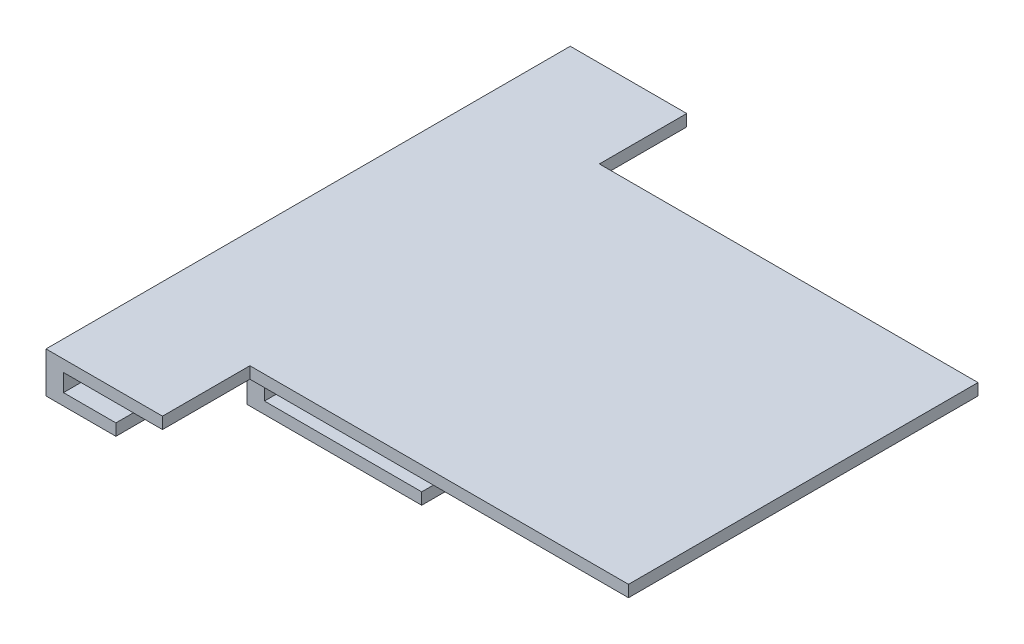
ISO-10303-21;
HEADER;
FILE_DESCRIPTION(('STEP AP214'),'2;1');
FILE_NAME('part.step','',(''),(''),'','','');
FILE_SCHEMA(('AUTOMOTIVE_DESIGN { 1 0 10303 214 1 1 1 1 }'));
ENDSEC;
DATA;
#1=APPLICATION_CONTEXT('core data for automotive mechanical design processes');
#2=APPLICATION_PROTOCOL_DEFINITION('international standard','automotive_design',2000,#1);
#3=PRODUCT_CONTEXT('',#1,'mechanical');
#4=PRODUCT('Part','Part','',(#3));
#5=PRODUCT_RELATED_PRODUCT_CATEGORY('part','',(#4));
#6=PRODUCT_DEFINITION_FORMATION('','',#4);
#7=PRODUCT_DEFINITION_CONTEXT('part definition',#1,'design');
#8=PRODUCT_DEFINITION('design','',#6,#7);
#9=PRODUCT_DEFINITION_SHAPE('','',#8);
#10=(LENGTH_UNIT() NAMED_UNIT(*) SI_UNIT(.MILLI.,.METRE.));
#11=(NAMED_UNIT(*) PLANE_ANGLE_UNIT() SI_UNIT($,.RADIAN.));
#12=(NAMED_UNIT(*) SI_UNIT($,.STERADIAN.) SOLID_ANGLE_UNIT());
#13=UNCERTAINTY_MEASURE_WITH_UNIT(LENGTH_MEASURE(1.E-05),#10,'distance_accuracy_value','');
#14=(GEOMETRIC_REPRESENTATION_CONTEXT(3) GLOBAL_UNCERTAINTY_ASSIGNED_CONTEXT((#13)) GLOBAL_UNIT_ASSIGNED_CONTEXT((#10,
#11,#12)) REPRESENTATION_CONTEXT('',''));
#15=CARTESIAN_POINT('',(0.,0.,0.));
#16=DIRECTION('',(0.,0.,1.));
#17=DIRECTION('',(1.,0.,0.));
#18=AXIS2_PLACEMENT_3D('',#15,#16,#17);
#19=CARTESIAN_POINT('',(0.,0.,0.));
#20=DIRECTION('',(0.,1.,0.));
#21=DIRECTION('',(0.,0.,1.));
#22=AXIS2_PLACEMENT_3D('',#19,#20,#21);
#23=PLANE('',#22);
#24=DIRECTION('',(0.,0.,1.));
#25=VECTOR('',#24,1.);
#26=CARTESIAN_POINT('',(-21.,0.,29.));
#27=LINE('',#26,#25);
#28=CARTESIAN_POINT('',(-21.,0.,-29.));
#29=VERTEX_POINT('',#28);
#30=CARTESIAN_POINT('',(-21.,0.,29.));
#31=VERTEX_POINT('',#30);
#32=EDGE_CURVE('E337',#29,#31,#27,.T.);
#33=ORIENTED_EDGE('',*,*,#32,.F.);
#34=DIRECTION('',(1.,0.,0.));
#35=VECTOR('',#34,1.);
#36=CARTESIAN_POINT('',(-24.,0.,-29.));
#37=LINE('',#36,#35);
#38=CARTESIAN_POINT('',(-24.,0.,-29.));
#39=VERTEX_POINT('',#38);
#40=EDGE_CURVE('E341',#39,#29,#37,.T.);
#41=ORIENTED_EDGE('',*,*,#40,.F.);
#42=DIRECTION('',(0.,0.,-1.));
#43=VECTOR('',#42,1.);
#44=CARTESIAN_POINT('',(-24.,0.,29.));
#45=LINE('',#44,#43);
#46=CARTESIAN_POINT('',(-24.,0.,29.));
#47=VERTEX_POINT('',#46);
#48=EDGE_CURVE('E213',#47,#39,#45,.T.);
#49=ORIENTED_EDGE('',*,*,#48,.F.);
#50=DIRECTION('',(-1.,0.,0.));
#51=VECTOR('',#50,1.);
#52=CARTESIAN_POINT('',(-24.,0.,29.));
#53=LINE('',#52,#51);
#54=EDGE_CURVE('E344',#31,#47,#53,.T.);
#55=ORIENTED_EDGE('',*,*,#54,.F.);
#56=EDGE_LOOP('',(#33,#41,#49,#55));
#57=FACE_BOUND('',#56,.T.);
#58=DIRECTION('',(0.,0.,1.));
#59=VECTOR('',#58,1.);
#60=CARTESIAN_POINT('',(-39.5,0.,-45.));
#61=LINE('',#60,#59);
#62=CARTESIAN_POINT('',(-39.5,0.,-45.));
#63=VERTEX_POINT('',#62);
#64=CARTESIAN_POINT('',(-39.5,0.,-32.5));
#65=VERTEX_POINT('',#64);
#66=EDGE_CURVE('E284',#63,#65,#61,.T.);
#67=ORIENTED_EDGE('',*,*,#66,.F.);
#68=DIRECTION('',(-1.,0.,0.));
#69=VECTOR('',#68,1.);
#70=CARTESIAN_POINT('',(-42.5,0.,-45.));
#71=LINE('',#70,#69);
#72=CARTESIAN_POINT('',(-22.5,0.,-45.));
#73=VERTEX_POINT('',#72);
#74=EDGE_CURVE('E381',#73,#63,#71,.T.);
#75=ORIENTED_EDGE('',*,*,#74,.F.);
#76=DIRECTION('',(0.,0.,-1.));
#77=VECTOR('',#76,1.);
#78=CARTESIAN_POINT('',(-22.5,0.,-30.));
#79=LINE('',#78,#77);
#80=CARTESIAN_POINT('',(-22.5,0.,-30.));
#81=VERTEX_POINT('',#80);
#82=EDGE_CURVE('E379',#81,#73,#79,.T.);
#83=ORIENTED_EDGE('',*,*,#82,.F.);
#84=DIRECTION('',(-1.,0.,0.));
#85=VECTOR('',#84,1.);
#86=CARTESIAN_POINT('',(-22.5,0.,-30.));
#87=LINE('',#86,#85);
#88=CARTESIAN_POINT('',(42.5,0.,-30.));
#89=VERTEX_POINT('',#88);
#90=EDGE_CURVE('E377',#89,#81,#87,.T.);
#91=ORIENTED_EDGE('',*,*,#90,.F.);
#92=DIRECTION('',(0.,0.,-1.));
#93=VECTOR('',#92,1.);
#94=CARTESIAN_POINT('',(42.5,0.,-30.));
#95=LINE('',#94,#93);
#96=CARTESIAN_POINT('',(42.5,0.,30.));
#97=VERTEX_POINT('',#96);
#98=EDGE_CURVE('E355',#97,#89,#95,.T.);
#99=ORIENTED_EDGE('',*,*,#98,.F.);
#100=DIRECTION('',(1.,0.,0.));
#101=VECTOR('',#100,1.);
#102=CARTESIAN_POINT('',(-22.5,0.,30.));
#103=LINE('',#102,#101);
#104=CARTESIAN_POINT('',(-22.5,0.,30.));
#105=VERTEX_POINT('',#104);
#106=EDGE_CURVE('E360',#105,#97,#103,.T.);
#107=ORIENTED_EDGE('',*,*,#106,.F.);
#108=DIRECTION('',(0.,0.,-1.));
#109=VECTOR('',#108,1.);
#110=CARTESIAN_POINT('',(-22.5,0.,30.));
#111=LINE('',#110,#109);
#112=CARTESIAN_POINT('',(-22.5,0.,45.));
#113=VERTEX_POINT('',#112);
#114=EDGE_CURVE('E388',#113,#105,#111,.T.);
#115=ORIENTED_EDGE('',*,*,#114,.F.);
#116=DIRECTION('',(1.,0.,0.));
#117=VECTOR('',#116,1.);
#118=CARTESIAN_POINT('',(-42.5,0.,45.));
#119=LINE('',#118,#117);
#120=CARTESIAN_POINT('',(-39.5,0.,45.));
#121=VERTEX_POINT('',#120);
#122=EDGE_CURVE('E386',#121,#113,#119,.T.);
#123=ORIENTED_EDGE('',*,*,#122,.F.);
#124=DIRECTION('',(0.,0.,1.));
#125=VECTOR('',#124,1.);
#126=CARTESIAN_POINT('',(-39.5,0.,45.));
#127=LINE('',#126,#125);
#128=CARTESIAN_POINT('',(-39.5,0.,32.5));
#129=VERTEX_POINT('',#128);
#130=EDGE_CURVE('E315',#129,#121,#127,.T.);
#131=ORIENTED_EDGE('',*,*,#130,.F.);
#132=DIRECTION('',(-1.,0.,0.));
#133=VECTOR('',#132,1.);
#134=CARTESIAN_POINT('',(-39.5,0.,32.5));
#135=LINE('',#134,#133);
#136=CARTESIAN_POINT('',(-30.5,0.,32.5));
#137=VERTEX_POINT('',#136);
#138=EDGE_CURVE('E321',#137,#129,#135,.T.);
#139=ORIENTED_EDGE('',*,*,#138,.F.);
#140=DIRECTION('',(0.,0.,1.));
#141=VECTOR('',#140,1.);
#142=CARTESIAN_POINT('',(-30.5,0.,29.5));
#143=LINE('',#142,#141);
#144=CARTESIAN_POINT('',(-30.5,0.,29.5));
#145=VERTEX_POINT('',#144);
#146=EDGE_CURVE('E319',#145,#137,#143,.T.);
#147=ORIENTED_EDGE('',*,*,#146,.F.);
#148=DIRECTION('',(1.,0.,0.));
#149=VECTOR('',#148,1.);
#150=CARTESIAN_POINT('',(-40.5243011084905,0.,29.5));
#151=LINE('',#150,#149);
#152=CARTESIAN_POINT('',(-42.5,0.,29.5));
#153=VERTEX_POINT('',#152);
#154=EDGE_CURVE('E310',#153,#145,#151,.T.);
#155=ORIENTED_EDGE('',*,*,#154,.F.);
#156=DIRECTION('',(0.,0.,1.));
#157=VECTOR('',#156,1.);
#158=CARTESIAN_POINT('',(-42.5,0.,30.));
#159=LINE('',#158,#157);
#160=CARTESIAN_POINT('',(-42.5,0.,-29.5));
#161=VERTEX_POINT('',#160);
#162=EDGE_CURVE('E384',#161,#153,#159,.T.);
#163=ORIENTED_EDGE('',*,*,#162,.F.);
#164=DIRECTION('',(-1.,0.,0.));
#165=VECTOR('',#164,1.);
#166=CARTESIAN_POINT('',(-42.5,0.,-29.5));
#167=LINE('',#166,#165);
#168=CARTESIAN_POINT('',(-30.5,0.,-29.5));
#169=VERTEX_POINT('',#168);
#170=EDGE_CURVE('E289',#169,#161,#167,.T.);
#171=ORIENTED_EDGE('',*,*,#170,.F.);
#172=DIRECTION('',(0.,0.,1.));
#173=VECTOR('',#172,1.);
#174=CARTESIAN_POINT('',(-30.5,0.,-29.5));
#175=LINE('',#174,#173);
#176=CARTESIAN_POINT('',(-30.5,0.,-32.5));
#177=VERTEX_POINT('',#176);
#178=EDGE_CURVE('E295',#177,#169,#175,.T.);
#179=ORIENTED_EDGE('',*,*,#178,.F.);
#180=DIRECTION('',(1.,0.,0.));
#181=VECTOR('',#180,1.);
#182=CARTESIAN_POINT('',(-39.5,0.,-32.5));
#183=LINE('',#182,#181);
#184=EDGE_CURVE('E293',#65,#177,#183,.T.);
#185=ORIENTED_EDGE('',*,*,#184,.F.);
#186=EDGE_LOOP('',(#67,#75,#83,#91,#99,#107,#115,#123,#131,#139,#147,#155,#163,#171,#179,#185));
#187=FACE_BOUND('',#186,.T.);
#188=ADVANCED_FACE('F33',(#57,#187),#23,.F.);
#189=CARTESIAN_POINT('',(42.5,2.,-30.));
#190=DIRECTION('',(-1.,0.,0.));
#191=DIRECTION('',(0.,0.,1.));
#192=AXIS2_PLACEMENT_3D('',#189,#190,#191);
#193=PLANE('',#192);
#194=ORIENTED_EDGE('',*,*,#98,.T.);
#195=DIRECTION('',(0.,-1.,0.));
#196=VECTOR('',#195,1.);
#197=CARTESIAN_POINT('',(42.5,2.,-30.));
#198=LINE('',#197,#196);
#199=CARTESIAN_POINT('',(42.5,2.,-30.));
#200=VERTEX_POINT('',#199);
#201=EDGE_CURVE('E11',#200,#89,#198,.T.);
#202=ORIENTED_EDGE('',*,*,#201,.F.);
#203=DIRECTION('',(0.,0.,-1.));
#204=VECTOR('',#203,1.);
#205=CARTESIAN_POINT('',(42.5,2.,-30.));
#206=LINE('',#205,#204);
#207=CARTESIAN_POINT('',(42.5,2.,30.));
#208=VERTEX_POINT('',#207);
#209=EDGE_CURVE('E356',#208,#200,#206,.T.);
#210=ORIENTED_EDGE('',*,*,#209,.F.);
#211=DIRECTION('',(0.,-1.,0.));
#212=VECTOR('',#211,1.);
#213=CARTESIAN_POINT('',(42.5,2.,30.));
#214=LINE('',#213,#212);
#215=EDGE_CURVE('E374',#208,#97,#214,.T.);
#216=ORIENTED_EDGE('',*,*,#215,.T.);
#217=EDGE_LOOP('',(#194,#202,#210,#216));
#218=FACE_BOUND('',#217,.T.);
#219=ADVANCED_FACE('F35',(#218),#193,.F.);
#220=CARTESIAN_POINT('',(-22.5,2.,-30.));
#221=DIRECTION('',(0.,0.,1.));
#222=DIRECTION('',(1.,0.,0.));
#223=AXIS2_PLACEMENT_3D('',#220,#221,#222);
#224=PLANE('',#223);
#225=ORIENTED_EDGE('',*,*,#90,.T.);
#226=DIRECTION('',(0.,-1.,0.));
#227=VECTOR('',#226,1.);
#228=CARTESIAN_POINT('',(-22.5,2.,-30.));
#229=LINE('',#228,#227);
#230=CARTESIAN_POINT('',(-22.5,2.,-30.));
#231=VERTEX_POINT('',#230);
#232=EDGE_CURVE('E41',#231,#81,#229,.T.);
#233=ORIENTED_EDGE('',*,*,#232,.F.);
#234=DIRECTION('',(-1.,0.,0.));
#235=VECTOR('',#234,1.);
#236=CARTESIAN_POINT('',(-22.5,2.,-30.));
#237=LINE('',#236,#235);
#238=EDGE_CURVE('E359',#200,#231,#237,.T.);
#239=ORIENTED_EDGE('',*,*,#238,.F.);
#240=ORIENTED_EDGE('',*,*,#201,.T.);
#241=EDGE_LOOP('',(#225,#233,#239,#240));
#242=FACE_BOUND('',#241,.T.);
#243=ADVANCED_FACE('F431',(#242),#224,.F.);
#244=CARTESIAN_POINT('',(-22.5,2.,-30.));
#245=DIRECTION('',(-1.,0.,0.));
#246=DIRECTION('',(0.,0.,1.));
#247=AXIS2_PLACEMENT_3D('',#244,#245,#246);
#248=PLANE('',#247);
#249=ORIENTED_EDGE('',*,*,#82,.T.);
#250=DIRECTION('',(0.,-1.,0.));
#251=VECTOR('',#250,1.);
#252=CARTESIAN_POINT('',(-22.5,2.,-45.));
#253=LINE('',#252,#251);
#254=CARTESIAN_POINT('',(-22.5,2.,-45.));
#255=VERTEX_POINT('',#254);
#256=EDGE_CURVE('E403',#255,#73,#253,.T.);
#257=ORIENTED_EDGE('',*,*,#256,.F.);
#258=DIRECTION('',(0.,0.,-1.));
#259=VECTOR('',#258,1.);
#260=CARTESIAN_POINT('',(-22.5,2.,-30.));
#261=LINE('',#260,#259);
#262=EDGE_CURVE('E362',#231,#255,#261,.T.);
#263=ORIENTED_EDGE('',*,*,#262,.F.);
#264=ORIENTED_EDGE('',*,*,#232,.T.);
#265=EDGE_LOOP('',(#249,#257,#263,#264));
#266=FACE_BOUND('',#265,.T.);
#267=ADVANCED_FACE('F410',(#266),#248,.F.);
#268=CARTESIAN_POINT('',(-42.5,2.,-45.));
#269=DIRECTION('',(0.,0.,1.));
#270=DIRECTION('',(1.,0.,0.));
#271=AXIS2_PLACEMENT_3D('',#268,#269,#270);
#272=PLANE('',#271);
#273=ORIENTED_EDGE('',*,*,#74,.T.);
#274=DIRECTION('',(0.,1.,0.));
#275=VECTOR('',#274,1.);
#276=CARTESIAN_POINT('',(-39.5,-3.,-45.));
#277=LINE('',#276,#275);
#278=CARTESIAN_POINT('',(-39.5,-3.,-45.));
#279=VERTEX_POINT('',#278);
#280=EDGE_CURVE('E308',#279,#63,#277,.T.);
#281=ORIENTED_EDGE('',*,*,#280,.F.);
#282=DIRECTION('',(1.,0.,0.));
#283=VECTOR('',#282,1.);
#284=CARTESIAN_POINT('',(-30.5,-3.,-45.));
#285=LINE('',#284,#283);
#286=CARTESIAN_POINT('',(-30.5,-3.,-45.));
#287=VERTEX_POINT('',#286);
#288=EDGE_CURVE('E252',#279,#287,#285,.T.);
#289=ORIENTED_EDGE('',*,*,#288,.T.);
#290=DIRECTION('',(0.,1.,0.));
#291=VECTOR('',#290,1.);
#292=CARTESIAN_POINT('',(-30.5,-5.,-45.));
#293=LINE('',#292,#291);
#294=CARTESIAN_POINT('',(-30.5,-5.,-45.));
#295=VERTEX_POINT('',#294);
#296=EDGE_CURVE('E260',#295,#287,#293,.T.);
#297=ORIENTED_EDGE('',*,*,#296,.F.);
#298=DIRECTION('',(1.,0.,0.));
#299=VECTOR('',#298,1.);
#300=CARTESIAN_POINT('',(-30.5,-5.,-45.));
#301=LINE('',#300,#299);
#302=CARTESIAN_POINT('',(-42.5,-5.,-45.));
#303=VERTEX_POINT('',#302);
#304=EDGE_CURVE('E258',#303,#295,#301,.T.);
#305=ORIENTED_EDGE('',*,*,#304,.F.);
#306=DIRECTION('',(0.,-1.,0.));
#307=VECTOR('',#306,1.);
#308=CARTESIAN_POINT('',(-42.5,2.,-45.));
#309=LINE('',#308,#307);
#310=CARTESIAN_POINT('',(-42.5,2.,-45.));
#311=VERTEX_POINT('',#310);
#312=EDGE_CURVE('E401',#311,#303,#309,.T.);
#313=ORIENTED_EDGE('',*,*,#312,.F.);
#314=DIRECTION('',(-1.,0.,0.));
#315=VECTOR('',#314,1.);
#316=CARTESIAN_POINT('',(-42.5,2.,-45.));
#317=LINE('',#316,#315);
#318=EDGE_CURVE('E364',#255,#311,#317,.T.);
#319=ORIENTED_EDGE('',*,*,#318,.F.);
#320=ORIENTED_EDGE('',*,*,#256,.T.);
#321=EDGE_LOOP('',(#273,#281,#289,#297,#305,#313,#319,#320));
#322=FACE_BOUND('',#321,.T.);
#323=ADVANCED_FACE('F420',(#322),#272,.F.);
#324=CARTESIAN_POINT('',(-42.5,2.,30.));
#325=DIRECTION('',(1.,0.,0.));
#326=DIRECTION('',(0.,0.,-1.));
#327=AXIS2_PLACEMENT_3D('',#324,#325,#326);
#328=PLANE('',#327);
#329=ORIENTED_EDGE('',*,*,#312,.T.);
#330=DIRECTION('',(0.,0.,-1.));
#331=VECTOR('',#330,1.);
#332=CARTESIAN_POINT('',(-42.5,-5.,-29.5));
#333=LINE('',#332,#331);
#334=CARTESIAN_POINT('',(-42.5,-5.,-29.5));
#335=VERTEX_POINT('',#334);
#336=EDGE_CURVE('E255',#335,#303,#333,.T.);
#337=ORIENTED_EDGE('',*,*,#336,.F.);
#338=DIRECTION('',(0.,1.,0.));
#339=VECTOR('',#338,1.);
#340=CARTESIAN_POINT('',(-42.5,-3.,-29.5));
#341=LINE('',#340,#339);
#342=EDGE_CURVE('E48',#335,#161,#341,.T.);
#343=ORIENTED_EDGE('',*,*,#342,.T.);
#344=ORIENTED_EDGE('',*,*,#162,.T.);
#345=DIRECTION('',(0.,1.,0.));
#346=VECTOR('',#345,1.);
#347=CARTESIAN_POINT('',(-42.5,-3.,29.5));
#348=LINE('',#347,#346);
#349=CARTESIAN_POINT('',(-42.5,-5.,29.5));
#350=VERTEX_POINT('',#349);
#351=EDGE_CURVE('E334',#350,#153,#348,.T.);
#352=ORIENTED_EDGE('',*,*,#351,.F.);
#353=DIRECTION('',(0.,0.,-1.));
#354=VECTOR('',#353,1.);
#355=CARTESIAN_POINT('',(-42.5,-5.,45.));
#356=LINE('',#355,#354);
#357=CARTESIAN_POINT('',(-42.5,-5.,45.));
#358=VERTEX_POINT('',#357);
#359=EDGE_CURVE('E267',#358,#350,#356,.T.);
#360=ORIENTED_EDGE('',*,*,#359,.F.);
#361=DIRECTION('',(0.,-1.,0.));
#362=VECTOR('',#361,1.);
#363=CARTESIAN_POINT('',(-42.5,2.,45.));
#364=LINE('',#363,#362);
#365=CARTESIAN_POINT('',(-42.5,2.,45.));
#366=VERTEX_POINT('',#365);
#367=EDGE_CURVE('E399',#366,#358,#364,.T.);
#368=ORIENTED_EDGE('',*,*,#367,.F.);
#369=DIRECTION('',(0.,0.,1.));
#370=VECTOR('',#369,1.);
#371=CARTESIAN_POINT('',(-42.5,2.,-30.));
#372=LINE('',#371,#370);
#373=EDGE_CURVE('E366',#311,#366,#372,.T.);
#374=ORIENTED_EDGE('',*,*,#373,.F.);
#375=EDGE_LOOP('',(#329,#337,#343,#344,#352,#360,#368,#374));
#376=FACE_BOUND('',#375,.T.);
#377=ADVANCED_FACE('F468',(#376),#328,.F.);
#378=CARTESIAN_POINT('',(-42.5,2.,45.));
#379=DIRECTION('',(0.,0.,-1.));
#380=DIRECTION('',(-1.,0.,0.));
#381=AXIS2_PLACEMENT_3D('',#378,#379,#380);
#382=PLANE('',#381);
#383=ORIENTED_EDGE('',*,*,#367,.T.);
#384=DIRECTION('',(-1.,0.,0.));
#385=VECTOR('',#384,1.);
#386=CARTESIAN_POINT('',(-42.5,-5.,45.));
#387=LINE('',#386,#385);
#388=CARTESIAN_POINT('',(-30.5,-5.,45.));
#389=VERTEX_POINT('',#388);
#390=EDGE_CURVE('E276',#389,#358,#387,.T.);
#391=ORIENTED_EDGE('',*,*,#390,.F.);
#392=DIRECTION('',(0.,1.,0.));
#393=VECTOR('',#392,1.);
#394=CARTESIAN_POINT('',(-30.5,-5.,45.));
#395=LINE('',#394,#393);
#396=CARTESIAN_POINT('',(-30.5,-3.,45.));
#397=VERTEX_POINT('',#396);
#398=EDGE_CURVE('E279',#389,#397,#395,.T.);
#399=ORIENTED_EDGE('',*,*,#398,.T.);
#400=DIRECTION('',(-1.,0.,0.));
#401=VECTOR('',#400,1.);
#402=CARTESIAN_POINT('',(-42.5,-3.,45.));
#403=LINE('',#402,#401);
#404=CARTESIAN_POINT('',(-39.5,-3.,45.));
#405=VERTEX_POINT('',#404);
#406=EDGE_CURVE('E271',#397,#405,#403,.T.);
#407=ORIENTED_EDGE('',*,*,#406,.T.);
#408=DIRECTION('',(0.,1.,0.));
#409=VECTOR('',#408,1.);
#410=CARTESIAN_POINT('',(-39.5,-3.,45.));
#411=LINE('',#410,#409);
#412=EDGE_CURVE('E56',#405,#121,#411,.T.);
#413=ORIENTED_EDGE('',*,*,#412,.T.);
#414=ORIENTED_EDGE('',*,*,#122,.T.);
#415=DIRECTION('',(0.,-1.,0.));
#416=VECTOR('',#415,1.);
#417=CARTESIAN_POINT('',(-22.5,2.,45.));
#418=LINE('',#417,#416);
#419=CARTESIAN_POINT('',(-22.5,2.,45.));
#420=VERTEX_POINT('',#419);
#421=EDGE_CURVE('E396',#420,#113,#418,.T.);
#422=ORIENTED_EDGE('',*,*,#421,.F.);
#423=DIRECTION('',(1.,0.,0.));
#424=VECTOR('',#423,1.);
#425=CARTESIAN_POINT('',(-42.5,2.,45.));
#426=LINE('',#425,#424);
#427=EDGE_CURVE('E368',#366,#420,#426,.T.);
#428=ORIENTED_EDGE('',*,*,#427,.F.);
#429=EDGE_LOOP('',(#383,#391,#399,#407,#413,#414,#422,#428));
#430=FACE_BOUND('',#429,.T.);
#431=ADVANCED_FACE('F446',(#430),#382,.F.);
#432=CARTESIAN_POINT('',(-22.5,2.,30.));
#433=DIRECTION('',(-1.,0.,0.));
#434=DIRECTION('',(0.,0.,1.));
#435=AXIS2_PLACEMENT_3D('',#432,#433,#434);
#436=PLANE('',#435);
#437=ORIENTED_EDGE('',*,*,#114,.T.);
#438=DIRECTION('',(0.,-1.,0.));
#439=VECTOR('',#438,1.);
#440=CARTESIAN_POINT('',(-22.5,2.,30.));
#441=LINE('',#440,#439);
#442=CARTESIAN_POINT('',(-22.5,2.,30.));
#443=VERTEX_POINT('',#442);
#444=EDGE_CURVE('E393',#443,#105,#441,.T.);
#445=ORIENTED_EDGE('',*,*,#444,.F.);
#446=DIRECTION('',(0.,0.,-1.));
#447=VECTOR('',#446,1.);
#448=CARTESIAN_POINT('',(-22.5,2.,30.));
#449=LINE('',#448,#447);
#450=EDGE_CURVE('E370',#420,#443,#449,.T.);
#451=ORIENTED_EDGE('',*,*,#450,.F.);
#452=ORIENTED_EDGE('',*,*,#421,.T.);
#453=EDGE_LOOP('',(#437,#445,#451,#452));
#454=FACE_BOUND('',#453,.T.);
#455=ADVANCED_FACE('F443',(#454),#436,.F.);
#456=CARTESIAN_POINT('',(-22.5,2.,30.));
#457=DIRECTION('',(0.,0.,-1.));
#458=DIRECTION('',(-1.,0.,0.));
#459=AXIS2_PLACEMENT_3D('',#456,#457,#458);
#460=PLANE('',#459);
#461=ORIENTED_EDGE('',*,*,#106,.T.);
#462=ORIENTED_EDGE('',*,*,#215,.F.);
#463=DIRECTION('',(1.,0.,0.));
#464=VECTOR('',#463,1.);
#465=CARTESIAN_POINT('',(-22.5,2.,30.));
#466=LINE('',#465,#464);
#467=EDGE_CURVE('E372',#443,#208,#466,.T.);
#468=ORIENTED_EDGE('',*,*,#467,.F.);
#469=ORIENTED_EDGE('',*,*,#444,.T.);
#470=EDGE_LOOP('',(#461,#462,#468,#469));
#471=FACE_BOUND('',#470,.T.);
#472=ADVANCED_FACE('F438',(#471),#460,.F.);
#473=CARTESIAN_POINT('',(0.,2.,0.));
#474=DIRECTION('',(0.,1.,0.));
#475=DIRECTION('',(0.,0.,1.));
#476=AXIS2_PLACEMENT_3D('',#473,#474,#475);
#477=PLANE('',#476);
#478=ORIENTED_EDGE('',*,*,#209,.T.);
#479=ORIENTED_EDGE('',*,*,#238,.T.);
#480=ORIENTED_EDGE('',*,*,#262,.T.);
#481=ORIENTED_EDGE('',*,*,#318,.T.);
#482=ORIENTED_EDGE('',*,*,#373,.T.);
#483=ORIENTED_EDGE('',*,*,#427,.T.);
#484=ORIENTED_EDGE('',*,*,#450,.T.);
#485=ORIENTED_EDGE('',*,*,#467,.T.);
#486=EDGE_LOOP('',(#478,#479,#480,#481,#482,#483,#484,#485));
#487=FACE_BOUND('',#486,.T.);
#488=ADVANCED_FACE('F427',(#487),#477,.T.);
#489=CARTESIAN_POINT('',(-21.,-3.,29.));
#490=DIRECTION('',(-1.,0.,0.));
#491=DIRECTION('',(0.,0.,1.));
#492=AXIS2_PLACEMENT_3D('',#489,#490,#491);
#493=PLANE('',#492);
#494=ORIENTED_EDGE('',*,*,#32,.T.);
#495=DIRECTION('',(0.,1.,0.));
#496=VECTOR('',#495,1.);
#497=CARTESIAN_POINT('',(-21.,-3.,29.));
#498=LINE('',#497,#496);
#499=CARTESIAN_POINT('',(-21.,-3.,29.));
#500=VERTEX_POINT('',#499);
#501=EDGE_CURVE('E352',#500,#31,#498,.T.);
#502=ORIENTED_EDGE('',*,*,#501,.F.);
#503=DIRECTION('',(0.,0.,1.));
#504=VECTOR('',#503,1.);
#505=CARTESIAN_POINT('',(-21.,-3.,29.));
#506=LINE('',#505,#504);
#507=CARTESIAN_POINT('',(-21.,-3.,-29.));
#508=VERTEX_POINT('',#507);
#509=EDGE_CURVE('E338',#508,#500,#506,.T.);
#510=ORIENTED_EDGE('',*,*,#509,.F.);
#511=DIRECTION('',(0.,1.,0.));
#512=VECTOR('',#511,1.);
#513=CARTESIAN_POINT('',(-21.,-3.,-29.));
#514=LINE('',#513,#512);
#515=EDGE_CURVE('E217',#508,#29,#514,.T.);
#516=ORIENTED_EDGE('',*,*,#515,.T.);
#517=EDGE_LOOP('',(#494,#502,#510,#516));
#518=FACE_BOUND('',#517,.T.);
#519=ADVANCED_FACE('F543',(#518),#493,.F.);
#520=CARTESIAN_POINT('',(-24.,-3.,29.));
#521=DIRECTION('',(0.,0.,-1.));
#522=DIRECTION('',(-1.,0.,0.));
#523=AXIS2_PLACEMENT_3D('',#520,#521,#522);
#524=PLANE('',#523);
#525=ORIENTED_EDGE('',*,*,#54,.T.);
#526=DIRECTION('',(0.,1.,0.));
#527=VECTOR('',#526,1.);
#528=CARTESIAN_POINT('',(-24.,-3.,29.));
#529=LINE('',#528,#527);
#530=CARTESIAN_POINT('',(-24.,-5.,29.));
#531=VERTEX_POINT('',#530);
#532=EDGE_CURVE('E216',#531,#47,#529,.T.);
#533=ORIENTED_EDGE('',*,*,#532,.F.);
#534=DIRECTION('',(-1.,0.,0.));
#535=VECTOR('',#534,1.);
#536=CARTESIAN_POINT('',(-24.,-5.,29.));
#537=LINE('',#536,#535);
#538=CARTESIAN_POINT('',(5.99999999999999,-5.,29.));
#539=VERTEX_POINT('',#538);
#540=EDGE_CURVE('E231',#539,#531,#537,.T.);
#541=ORIENTED_EDGE('',*,*,#540,.F.);
#542=DIRECTION('',(0.,1.,0.));
#543=VECTOR('',#542,1.);
#544=CARTESIAN_POINT('',(5.99999999999999,-5.,29.));
#545=LINE('',#544,#543);
#546=CARTESIAN_POINT('',(5.99999999999999,-3.,29.));
#547=VERTEX_POINT('',#546);
#548=EDGE_CURVE('E240',#539,#547,#545,.T.);
#549=ORIENTED_EDGE('',*,*,#548,.T.);
#550=DIRECTION('',(-1.,0.,0.));
#551=VECTOR('',#550,1.);
#552=CARTESIAN_POINT('',(-24.,-3.,29.));
#553=LINE('',#552,#551);
#554=EDGE_CURVE('E232',#547,#500,#553,.T.);
#555=ORIENTED_EDGE('',*,*,#554,.T.);
#556=ORIENTED_EDGE('',*,*,#501,.T.);
#557=EDGE_LOOP('',(#525,#533,#541,#549,#555,#556));
#558=FACE_BOUND('',#557,.T.);
#559=ADVANCED_FACE('F548',(#558),#524,.F.);
#560=CARTESIAN_POINT('',(-24.,-3.,29.));
#561=DIRECTION('',(1.,0.,0.));
#562=DIRECTION('',(0.,0.,-1.));
#563=AXIS2_PLACEMENT_3D('',#560,#561,#562);
#564=PLANE('',#563);
#565=ORIENTED_EDGE('',*,*,#48,.T.);
#566=DIRECTION('',(0.,1.,0.));
#567=VECTOR('',#566,1.);
#568=CARTESIAN_POINT('',(-24.,-3.,-29.));
#569=LINE('',#568,#567);
#570=CARTESIAN_POINT('',(-24.,-5.,-29.));
#571=VERTEX_POINT('',#570);
#572=EDGE_CURVE('E207',#571,#39,#569,.T.);
#573=ORIENTED_EDGE('',*,*,#572,.F.);
#574=DIRECTION('',(0.,0.,-1.));
#575=VECTOR('',#574,1.);
#576=CARTESIAN_POINT('',(-24.,-5.,29.));
#577=LINE('',#576,#575);
#578=EDGE_CURVE('E212',#531,#571,#577,.T.);
#579=ORIENTED_EDGE('',*,*,#578,.F.);
#580=ORIENTED_EDGE('',*,*,#532,.T.);
#581=EDGE_LOOP('',(#565,#573,#579,#580));
#582=FACE_BOUND('',#581,.T.);
#583=ADVANCED_FACE('F209',(#582),#564,.F.);
#584=CARTESIAN_POINT('',(-24.,-3.,-29.));
#585=DIRECTION('',(0.,0.,1.));
#586=DIRECTION('',(1.,0.,0.));
#587=AXIS2_PLACEMENT_3D('',#584,#585,#586);
#588=PLANE('',#587);
#589=ORIENTED_EDGE('',*,*,#40,.T.);
#590=ORIENTED_EDGE('',*,*,#515,.F.);
#591=DIRECTION('',(1.,0.,0.));
#592=VECTOR('',#591,1.);
#593=CARTESIAN_POINT('',(-24.,-3.,-29.));
#594=LINE('',#593,#592);
#595=CARTESIAN_POINT('',(5.99999999999999,-3.,-29.));
#596=VERTEX_POINT('',#595);
#597=EDGE_CURVE('E241',#508,#596,#594,.T.);
#598=ORIENTED_EDGE('',*,*,#597,.T.);
#599=DIRECTION('',(0.,1.,0.));
#600=VECTOR('',#599,1.);
#601=CARTESIAN_POINT('',(5.99999999999999,-5.,-29.));
#602=LINE('',#601,#600);
#603=CARTESIAN_POINT('',(5.99999999999999,-5.,-29.));
#604=VERTEX_POINT('',#603);
#605=EDGE_CURVE('E223',#604,#596,#602,.T.);
#606=ORIENTED_EDGE('',*,*,#605,.F.);
#607=DIRECTION('',(1.,0.,0.));
#608=VECTOR('',#607,1.);
#609=CARTESIAN_POINT('',(-24.,-5.,-29.));
#610=LINE('',#609,#608);
#611=EDGE_CURVE('E220',#571,#604,#610,.T.);
#612=ORIENTED_EDGE('',*,*,#611,.F.);
#613=ORIENTED_EDGE('',*,*,#572,.T.);
#614=EDGE_LOOP('',(#589,#590,#598,#606,#612,#613));
#615=FACE_BOUND('',#614,.T.);
#616=ADVANCED_FACE('F221',(#615),#588,.F.);
#617=CARTESIAN_POINT('',(-40.5243011084905,-3.,29.5));
#618=DIRECTION('',(0.,0.,1.));
#619=DIRECTION('',(1.,0.,0.));
#620=AXIS2_PLACEMENT_3D('',#617,#618,#619);
#621=PLANE('',#620);
#622=ORIENTED_EDGE('',*,*,#154,.T.);
#623=DIRECTION('',(0.,1.,0.));
#624=VECTOR('',#623,1.);
#625=CARTESIAN_POINT('',(-30.5,-3.,29.5));
#626=LINE('',#625,#624);
#627=CARTESIAN_POINT('',(-30.5,-5.,29.5));
#628=VERTEX_POINT('',#627);
#629=EDGE_CURVE('E331',#628,#145,#626,.T.);
#630=ORIENTED_EDGE('',*,*,#629,.F.);
#631=DIRECTION('',(1.,0.,0.));
#632=VECTOR('',#631,1.);
#633=CARTESIAN_POINT('',(-42.5,-5.,29.5));
#634=LINE('',#633,#632);
#635=EDGE_CURVE('E270',#350,#628,#634,.T.);
#636=ORIENTED_EDGE('',*,*,#635,.F.);
#637=ORIENTED_EDGE('',*,*,#351,.T.);
#638=EDGE_LOOP('',(#622,#630,#636,#637));
#639=FACE_BOUND('',#638,.T.);
#640=ADVANCED_FACE('F465',(#639),#621,.F.);
#641=CARTESIAN_POINT('',(-30.5,-3.,29.5));
#642=DIRECTION('',(-1.,0.,0.));
#643=DIRECTION('',(0.,0.,1.));
#644=AXIS2_PLACEMENT_3D('',#641,#642,#643);
#645=PLANE('',#644);
#646=ORIENTED_EDGE('',*,*,#146,.T.);
#647=DIRECTION('',(0.,1.,0.));
#648=VECTOR('',#647,1.);
#649=CARTESIAN_POINT('',(-30.5,-3.,32.5));
#650=LINE('',#649,#648);
#651=CARTESIAN_POINT('',(-30.5,-3.,32.5));
#652=VERTEX_POINT('',#651);
#653=EDGE_CURVE('E328',#652,#137,#650,.T.);
#654=ORIENTED_EDGE('',*,*,#653,.F.);
#655=DIRECTION('',(0.,0.,1.));
#656=VECTOR('',#655,1.);
#657=CARTESIAN_POINT('',(-30.5,-3.,45.));
#658=LINE('',#657,#656);
#659=EDGE_CURVE('E266',#652,#397,#658,.T.);
#660=ORIENTED_EDGE('',*,*,#659,.T.);
#661=ORIENTED_EDGE('',*,*,#398,.F.);
#662=DIRECTION('',(0.,0.,1.));
#663=VECTOR('',#662,1.);
#664=CARTESIAN_POINT('',(-30.5,-5.,45.));
#665=LINE('',#664,#663);
#666=EDGE_CURVE('E274',#628,#389,#665,.T.);
#667=ORIENTED_EDGE('',*,*,#666,.F.);
#668=ORIENTED_EDGE('',*,*,#629,.T.);
#669=EDGE_LOOP('',(#646,#654,#660,#661,#667,#668));
#670=FACE_BOUND('',#669,.T.);
#671=ADVANCED_FACE('F458',(#670),#645,.F.);
#672=CARTESIAN_POINT('',(-39.5,-3.,32.5));
#673=DIRECTION('',(0.,0.,-1.));
#674=DIRECTION('',(-1.,0.,0.));
#675=AXIS2_PLACEMENT_3D('',#672,#673,#674);
#676=PLANE('',#675);
#677=ORIENTED_EDGE('',*,*,#138,.T.);
#678=DIRECTION('',(0.,1.,0.));
#679=VECTOR('',#678,1.);
#680=CARTESIAN_POINT('',(-39.5,-3.,32.5));
#681=LINE('',#680,#679);
#682=CARTESIAN_POINT('',(-39.5,-3.,32.5));
#683=VERTEX_POINT('',#682);
#684=EDGE_CURVE('E325',#683,#129,#681,.T.);
#685=ORIENTED_EDGE('',*,*,#684,.F.);
#686=DIRECTION('',(-1.,0.,0.));
#687=VECTOR('',#686,1.);
#688=CARTESIAN_POINT('',(-39.5,-3.,32.5));
#689=LINE('',#688,#687);
#690=EDGE_CURVE('E311',#652,#683,#689,.T.);
#691=ORIENTED_EDGE('',*,*,#690,.F.);
#692=ORIENTED_EDGE('',*,*,#653,.T.);
#693=EDGE_LOOP('',(#677,#685,#691,#692));
#694=FACE_BOUND('',#693,.T.);
#695=ADVANCED_FACE('F455',(#694),#676,.F.);
#696=CARTESIAN_POINT('',(-39.5,-3.,45.));
#697=DIRECTION('',(-1.,0.,0.));
#698=DIRECTION('',(0.,0.,1.));
#699=AXIS2_PLACEMENT_3D('',#696,#697,#698);
#700=PLANE('',#699);
#701=ORIENTED_EDGE('',*,*,#130,.T.);
#702=ORIENTED_EDGE('',*,*,#412,.F.);
#703=DIRECTION('',(0.,0.,1.));
#704=VECTOR('',#703,1.);
#705=CARTESIAN_POINT('',(-39.5,-3.,45.));
#706=LINE('',#705,#704);
#707=EDGE_CURVE('E314',#683,#405,#706,.T.);
#708=ORIENTED_EDGE('',*,*,#707,.F.);
#709=ORIENTED_EDGE('',*,*,#684,.T.);
#710=EDGE_LOOP('',(#701,#702,#708,#709));
#711=FACE_BOUND('',#710,.T.);
#712=ADVANCED_FACE('F451',(#711),#700,.F.);
#713=CARTESIAN_POINT('',(-39.5,-3.,-45.));
#714=DIRECTION('',(-1.,0.,0.));
#715=DIRECTION('',(0.,0.,1.));
#716=AXIS2_PLACEMENT_3D('',#713,#714,#715);
#717=PLANE('',#716);
#718=ORIENTED_EDGE('',*,*,#66,.T.);
#719=DIRECTION('',(0.,1.,0.));
#720=VECTOR('',#719,1.);
#721=CARTESIAN_POINT('',(-39.5,-3.,-32.5));
#722=LINE('',#721,#720);
#723=CARTESIAN_POINT('',(-39.5,-3.,-32.5));
#724=VERTEX_POINT('',#723);
#725=EDGE_CURVE('E305',#724,#65,#722,.T.);
#726=ORIENTED_EDGE('',*,*,#725,.F.);
#727=DIRECTION('',(0.,0.,1.));
#728=VECTOR('',#727,1.);
#729=CARTESIAN_POINT('',(-39.5,-3.,-45.));
#730=LINE('',#729,#728);
#731=EDGE_CURVE('E285',#279,#724,#730,.T.);
#732=ORIENTED_EDGE('',*,*,#731,.F.);
#733=ORIENTED_EDGE('',*,*,#280,.T.);
#734=EDGE_LOOP('',(#718,#726,#732,#733));
#735=FACE_BOUND('',#734,.T.);
#736=ADVANCED_FACE('F592',(#735),#717,.F.);
#737=CARTESIAN_POINT('',(-39.5,-3.,-32.5));
#738=DIRECTION('',(0.,0.,1.));
#739=DIRECTION('',(1.,0.,0.));
#740=AXIS2_PLACEMENT_3D('',#737,#738,#739);
#741=PLANE('',#740);
#742=ORIENTED_EDGE('',*,*,#184,.T.);
#743=DIRECTION('',(0.,1.,0.));
#744=VECTOR('',#743,1.);
#745=CARTESIAN_POINT('',(-30.5,-3.,-32.5));
#746=LINE('',#745,#744);
#747=CARTESIAN_POINT('',(-30.5,-3.,-32.5));
#748=VERTEX_POINT('',#747);
#749=EDGE_CURVE('E302',#748,#177,#746,.T.);
#750=ORIENTED_EDGE('',*,*,#749,.F.);
#751=DIRECTION('',(1.,0.,0.));
#752=VECTOR('',#751,1.);
#753=CARTESIAN_POINT('',(-39.5,-3.,-32.5));
#754=LINE('',#753,#752);
#755=EDGE_CURVE('E288',#724,#748,#754,.T.);
#756=ORIENTED_EDGE('',*,*,#755,.F.);
#757=ORIENTED_EDGE('',*,*,#725,.T.);
#758=EDGE_LOOP('',(#742,#750,#756,#757));
#759=FACE_BOUND('',#758,.T.);
#760=ADVANCED_FACE('F599',(#759),#741,.F.);
#761=CARTESIAN_POINT('',(-30.5,-3.,-29.5));
#762=DIRECTION('',(-1.,0.,0.));
#763=DIRECTION('',(0.,0.,1.));
#764=AXIS2_PLACEMENT_3D('',#761,#762,#763);
#765=PLANE('',#764);
#766=ORIENTED_EDGE('',*,*,#178,.T.);
#767=DIRECTION('',(0.,1.,0.));
#768=VECTOR('',#767,1.);
#769=CARTESIAN_POINT('',(-30.5,-3.,-29.5));
#770=LINE('',#769,#768);
#771=CARTESIAN_POINT('',(-30.5,-5.,-29.5));
#772=VERTEX_POINT('',#771);
#773=EDGE_CURVE('E299',#772,#169,#770,.T.);
#774=ORIENTED_EDGE('',*,*,#773,.F.);
#775=DIRECTION('',(0.,0.,1.));
#776=VECTOR('',#775,1.);
#777=CARTESIAN_POINT('',(-30.5,-5.,-29.5));
#778=LINE('',#777,#776);
#779=EDGE_CURVE('E248',#295,#772,#778,.T.);
#780=ORIENTED_EDGE('',*,*,#779,.F.);
#781=ORIENTED_EDGE('',*,*,#296,.T.);
#782=DIRECTION('',(0.,0.,1.));
#783=VECTOR('',#782,1.);
#784=CARTESIAN_POINT('',(-30.5,-3.,-29.5));
#785=LINE('',#784,#783);
#786=EDGE_CURVE('E247',#287,#748,#785,.T.);
#787=ORIENTED_EDGE('',*,*,#786,.T.);
#788=ORIENTED_EDGE('',*,*,#749,.T.);
#789=EDGE_LOOP('',(#766,#774,#780,#781,#787,#788));
#790=FACE_BOUND('',#789,.T.);
#791=ADVANCED_FACE('F484',(#790),#765,.F.);
#792=CARTESIAN_POINT('',(-42.5,-3.,-29.5));
#793=DIRECTION('',(0.,0.,-1.));
#794=DIRECTION('',(-1.,0.,0.));
#795=AXIS2_PLACEMENT_3D('',#792,#793,#794);
#796=PLANE('',#795);
#797=ORIENTED_EDGE('',*,*,#170,.T.);
#798=ORIENTED_EDGE('',*,*,#342,.F.);
#799=DIRECTION('',(-1.,0.,0.));
#800=VECTOR('',#799,1.);
#801=CARTESIAN_POINT('',(-30.5,-5.,-29.5));
#802=LINE('',#801,#800);
#803=EDGE_CURVE('E251',#772,#335,#802,.T.);
#804=ORIENTED_EDGE('',*,*,#803,.F.);
#805=ORIENTED_EDGE('',*,*,#773,.T.);
#806=EDGE_LOOP('',(#797,#798,#804,#805));
#807=FACE_BOUND('',#806,.T.);
#808=ADVANCED_FACE('F476',(#807),#796,.F.);
#809=CARTESIAN_POINT('',(0.,-3.,0.));
#810=DIRECTION('',(0.,-1.,0.));
#811=DIRECTION('',(0.,0.,-1.));
#812=AXIS2_PLACEMENT_3D('',#809,#810,#811);
#813=PLANE('',#812);
#814=ORIENTED_EDGE('',*,*,#659,.F.);
#815=ORIENTED_EDGE('',*,*,#690,.T.);
#816=ORIENTED_EDGE('',*,*,#707,.T.);
#817=ORIENTED_EDGE('',*,*,#406,.F.);
#818=EDGE_LOOP('',(#814,#815,#816,#817));
#819=FACE_BOUND('',#818,.T.);
#820=ADVANCED_FACE('F474',(#819),#813,.F.);
#821=CARTESIAN_POINT('',(0.,-5.,0.));
#822=DIRECTION('',(0.,-1.,0.));
#823=DIRECTION('',(0.,0.,-1.));
#824=AXIS2_PLACEMENT_3D('',#821,#822,#823);
#825=PLANE('',#824);
#826=ORIENTED_EDGE('',*,*,#359,.T.);
#827=ORIENTED_EDGE('',*,*,#635,.T.);
#828=ORIENTED_EDGE('',*,*,#666,.T.);
#829=ORIENTED_EDGE('',*,*,#390,.T.);
#830=EDGE_LOOP('',(#826,#827,#828,#829));
#831=FACE_BOUND('',#830,.T.);
#832=ADVANCED_FACE('F470',(#831),#825,.T.);
#833=CARTESIAN_POINT('',(0.,-3.,0.));
#834=DIRECTION('',(0.,1.,0.));
#835=DIRECTION('',(0.,0.,1.));
#836=AXIS2_PLACEMENT_3D('',#833,#834,#835);
#837=PLANE('',#836);
#838=ORIENTED_EDGE('',*,*,#731,.T.);
#839=ORIENTED_EDGE('',*,*,#755,.T.);
#840=ORIENTED_EDGE('',*,*,#786,.F.);
#841=ORIENTED_EDGE('',*,*,#288,.F.);
#842=EDGE_LOOP('',(#838,#839,#840,#841));
#843=FACE_BOUND('',#842,.T.);
#844=ADVANCED_FACE('F482',(#843),#837,.T.);
#845=CARTESIAN_POINT('',(0.,-5.,0.));
#846=DIRECTION('',(0.,1.,0.));
#847=DIRECTION('',(0.,0.,1.));
#848=AXIS2_PLACEMENT_3D('',#845,#846,#847);
#849=PLANE('',#848);
#850=ORIENTED_EDGE('',*,*,#779,.T.);
#851=ORIENTED_EDGE('',*,*,#803,.T.);
#852=ORIENTED_EDGE('',*,*,#336,.T.);
#853=ORIENTED_EDGE('',*,*,#304,.T.);
#854=EDGE_LOOP('',(#850,#851,#852,#853));
#855=FACE_BOUND('',#854,.T.);
#856=ADVANCED_FACE('F639',(#855),#849,.F.);
#857=CARTESIAN_POINT('',(0.,-3.,0.));
#858=DIRECTION('',(0.,-1.,0.));
#859=DIRECTION('',(0.,0.,-1.));
#860=AXIS2_PLACEMENT_3D('',#857,#858,#859);
#861=PLANE('',#860);
#862=ORIENTED_EDGE('',*,*,#597,.F.);
#863=ORIENTED_EDGE('',*,*,#509,.T.);
#864=ORIENTED_EDGE('',*,*,#554,.F.);
#865=DIRECTION('',(0.,0.,1.));
#866=VECTOR('',#865,1.);
#867=CARTESIAN_POINT('',(5.99999999999999,-3.,29.));
#868=LINE('',#867,#866);
#869=EDGE_CURVE('E235',#596,#547,#868,.T.);
#870=ORIENTED_EDGE('',*,*,#869,.F.);
#871=EDGE_LOOP('',(#862,#863,#864,#870));
#872=FACE_BOUND('',#871,.T.);
#873=ADVANCED_FACE('F649',(#872),#861,.F.);
#874=CARTESIAN_POINT('',(5.99999999999999,-5.,29.));
#875=DIRECTION('',(-1.,0.,0.));
#876=DIRECTION('',(0.,0.,1.));
#877=AXIS2_PLACEMENT_3D('',#874,#875,#876);
#878=PLANE('',#877);
#879=ORIENTED_EDGE('',*,*,#869,.T.);
#880=ORIENTED_EDGE('',*,*,#548,.F.);
#881=DIRECTION('',(0.,0.,1.));
#882=VECTOR('',#881,1.);
#883=CARTESIAN_POINT('',(5.99999999999999,-5.,29.));
#884=LINE('',#883,#882);
#885=EDGE_CURVE('E226',#604,#539,#884,.T.);
#886=ORIENTED_EDGE('',*,*,#885,.F.);
#887=ORIENTED_EDGE('',*,*,#605,.T.);
#888=EDGE_LOOP('',(#879,#880,#886,#887));
#889=FACE_BOUND('',#888,.T.);
#890=ADVANCED_FACE('F659',(#889),#878,.F.);
#891=CARTESIAN_POINT('',(0.,-5.,0.));
#892=DIRECTION('',(0.,-1.,0.));
#893=DIRECTION('',(0.,0.,-1.));
#894=AXIS2_PLACEMENT_3D('',#891,#892,#893);
#895=PLANE('',#894);
#896=ORIENTED_EDGE('',*,*,#578,.T.);
#897=ORIENTED_EDGE('',*,*,#611,.T.);
#898=ORIENTED_EDGE('',*,*,#885,.T.);
#899=ORIENTED_EDGE('',*,*,#540,.T.);
#900=EDGE_LOOP('',(#896,#897,#898,#899));
#901=FACE_BOUND('',#900,.T.);
#902=ADVANCED_FACE('F229',(#901),#895,.T.);
#903=CLOSED_SHELL('',(#188,#219,#243,#267,#323,#377,#431,#455,#472,#488,#519,#559,#583,#616,
#640,#671,#695,#712,#736,#760,#791,#808,#820,#832,#844,#856,#873,#890,#902));
#904=MANIFOLD_SOLID_BREP('B2',#903);
#905=ADVANCED_BREP_SHAPE_REPRESENTATION('',(#18,#904),#14);
#906=SHAPE_DEFINITION_REPRESENTATION(#9,#905);
ENDSEC;
END-ISO-10303-21;
